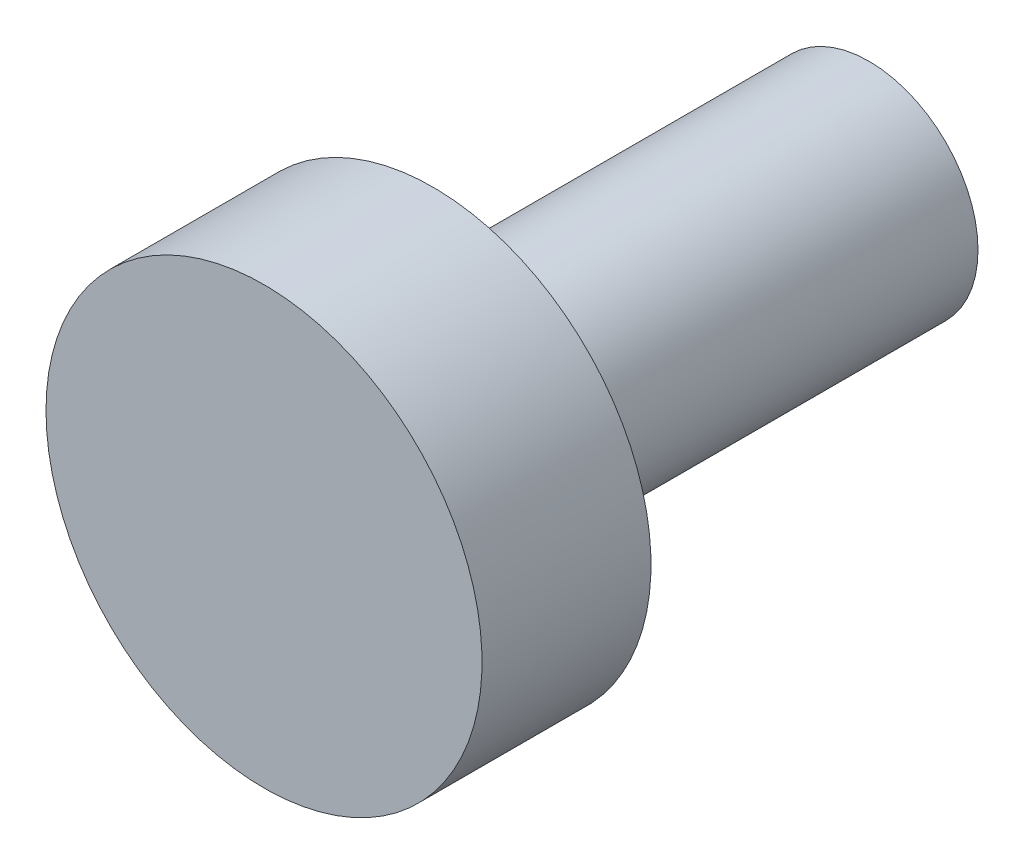
ISO-10303-21;
HEADER;
FILE_DESCRIPTION(('STEP AP214'),'2;1');
FILE_NAME('part.step','',(''),(''),'','','');
FILE_SCHEMA(('AUTOMOTIVE_DESIGN { 1 0 10303 214 1 1 1 1 }'));
ENDSEC;
DATA;
#1=APPLICATION_CONTEXT('core data for automotive mechanical design processes');
#2=APPLICATION_PROTOCOL_DEFINITION('international standard','automotive_design',2000,#1);
#3=PRODUCT_CONTEXT('',#1,'mechanical');
#4=PRODUCT('Part','Part','',(#3));
#5=PRODUCT_RELATED_PRODUCT_CATEGORY('part','',(#4));
#6=PRODUCT_DEFINITION_FORMATION('','',#4);
#7=PRODUCT_DEFINITION_CONTEXT('part definition',#1,'design');
#8=PRODUCT_DEFINITION('design','',#6,#7);
#9=PRODUCT_DEFINITION_SHAPE('','',#8);
#10=(LENGTH_UNIT() NAMED_UNIT(*) SI_UNIT(.MILLI.,.METRE.));
#11=(NAMED_UNIT(*) PLANE_ANGLE_UNIT() SI_UNIT($,.RADIAN.));
#12=(NAMED_UNIT(*) SI_UNIT($,.STERADIAN.) SOLID_ANGLE_UNIT());
#13=UNCERTAINTY_MEASURE_WITH_UNIT(LENGTH_MEASURE(1.E-05),#10,'distance_accuracy_value','');
#14=(GEOMETRIC_REPRESENTATION_CONTEXT(3) GLOBAL_UNCERTAINTY_ASSIGNED_CONTEXT((#13)) GLOBAL_UNIT_ASSIGNED_CONTEXT((#10,
#11,#12)) REPRESENTATION_CONTEXT('',''));
#15=CARTESIAN_POINT('',(0.,0.,0.));
#16=DIRECTION('',(0.,0.,1.));
#17=DIRECTION('',(1.,0.,0.));
#18=AXIS2_PLACEMENT_3D('',#15,#16,#17);
#19=CARTESIAN_POINT('',(0.,0.,3.1));
#20=DIRECTION('',(0.,0.,-1.));
#21=DIRECTION('',(-1.,0.,0.));
#22=AXIS2_PLACEMENT_3D('',#19,#20,#21);
#23=CYLINDRICAL_SURFACE('',#22,4.);
#24=CARTESIAN_POINT('',(0.,0.,3.1));
#25=DIRECTION('',(0.,0.,1.));
#26=DIRECTION('',(1.,0.,0.));
#27=AXIS2_PLACEMENT_3D('',#24,#25,#26);
#28=CIRCLE('',#27,4.);
#29=CARTESIAN_POINT('',(-4.,0.,3.1));
#30=VERTEX_POINT('',#29);
#31=EDGE_CURVE('E37',#30,#30,#28,.T.);
#32=CARTESIAN_POINT('',(0.,0.,0.));
#33=DIRECTION('',(0.,0.,1.));
#34=DIRECTION('',(1.,0.,0.));
#35=AXIS2_PLACEMENT_3D('',#32,#33,#34);
#36=CIRCLE('',#35,4.);
#37=CARTESIAN_POINT('',(-4.,0.,0.));
#38=VERTEX_POINT('',#37);
#39=EDGE_CURVE('E33',#38,#38,#36,.T.);
#40=CARTESIAN_POINT('',(-4.,0.,3.1));
#41=CARTESIAN_POINT('',(-4.,0.,3.06770833333333));
#42=CARTESIAN_POINT('',(-4.,0.,3.03541666666667));
#43=CARTESIAN_POINT('',(-4.,0.,2.97083333333333));
#44=CARTESIAN_POINT('',(-4.,0.,2.93854166666667));
#45=CARTESIAN_POINT('',(-4.,0.,2.87395833333333));
#46=CARTESIAN_POINT('',(-4.,0.,2.84166666666667));
#47=CARTESIAN_POINT('',(-4.,0.,2.77708333333333));
#48=CARTESIAN_POINT('',(-4.,0.,2.74479166666667));
#49=CARTESIAN_POINT('',(-4.,0.,2.68020833333333));
#50=CARTESIAN_POINT('',(-4.,0.,2.64791666666667));
#51=CARTESIAN_POINT('',(-4.,0.,2.58333333333333));
#52=CARTESIAN_POINT('',(-4.,0.,2.55104166666667));
#53=CARTESIAN_POINT('',(-4.,0.,2.48645833333333));
#54=CARTESIAN_POINT('',(-4.,0.,2.45416666666667));
#55=CARTESIAN_POINT('',(-4.,0.,2.38958333333333));
#56=CARTESIAN_POINT('',(-4.,0.,2.35729166666667));
#57=CARTESIAN_POINT('',(-4.,0.,2.29270833333333));
#58=CARTESIAN_POINT('',(-4.,0.,2.26041666666667));
#59=CARTESIAN_POINT('',(-4.,0.,2.19583333333333));
#60=CARTESIAN_POINT('',(-4.,0.,2.16354166666667));
#61=CARTESIAN_POINT('',(-4.,0.,2.09895833333333));
#62=CARTESIAN_POINT('',(-4.,0.,2.06666666666667));
#63=CARTESIAN_POINT('',(-4.,0.,2.00208333333333));
#64=CARTESIAN_POINT('',(-4.,0.,1.96979166666667));
#65=CARTESIAN_POINT('',(-4.,0.,1.90520833333333));
#66=CARTESIAN_POINT('',(-4.,0.,1.87291666666667));
#67=CARTESIAN_POINT('',(-4.,0.,1.80833333333333));
#68=CARTESIAN_POINT('',(-4.,0.,1.77604166666667));
#69=CARTESIAN_POINT('',(-4.,0.,1.71145833333333));
#70=CARTESIAN_POINT('',(-4.,0.,1.67916666666667));
#71=CARTESIAN_POINT('',(-4.,0.,1.61458333333333));
#72=CARTESIAN_POINT('',(-4.,0.,1.58229166666667));
#73=CARTESIAN_POINT('',(-4.,0.,1.51770833333333));
#74=CARTESIAN_POINT('',(-4.,0.,1.48541666666667));
#75=CARTESIAN_POINT('',(-4.,0.,1.42083333333333));
#76=CARTESIAN_POINT('',(-4.,0.,1.38854166666667));
#77=CARTESIAN_POINT('',(-4.,0.,1.32395833333333));
#78=CARTESIAN_POINT('',(-4.,0.,1.29166666666667));
#79=CARTESIAN_POINT('',(-4.,0.,1.22708333333333));
#80=CARTESIAN_POINT('',(-4.,0.,1.19479166666667));
#81=CARTESIAN_POINT('',(-4.,0.,1.13020833333333));
#82=CARTESIAN_POINT('',(-4.,0.,1.09791666666667));
#83=CARTESIAN_POINT('',(-4.,0.,1.03333333333333));
#84=CARTESIAN_POINT('',(-4.,0.,1.00104166666667));
#85=CARTESIAN_POINT('',(-4.,0.,0.936458333333333));
#86=CARTESIAN_POINT('',(-4.,0.,0.904166666666667));
#87=CARTESIAN_POINT('',(-4.,0.,0.839583333333333));
#88=CARTESIAN_POINT('',(-4.,0.,0.807291666666667));
#89=CARTESIAN_POINT('',(-4.,0.,0.742708333333333));
#90=CARTESIAN_POINT('',(-4.,0.,0.710416666666667));
#91=CARTESIAN_POINT('',(-4.,0.,0.645833333333333));
#92=CARTESIAN_POINT('',(-4.,0.,0.613541666666667));
#93=CARTESIAN_POINT('',(-4.,0.,0.548958333333333));
#94=CARTESIAN_POINT('',(-4.,0.,0.516666666666667));
#95=CARTESIAN_POINT('',(-4.,0.,0.452083333333333));
#96=CARTESIAN_POINT('',(-4.,0.,0.419791666666667));
#97=CARTESIAN_POINT('',(-4.,0.,0.355208333333333));
#98=CARTESIAN_POINT('',(-4.,0.,0.322916666666667));
#99=CARTESIAN_POINT('',(-4.,0.,0.258333333333333));
#100=CARTESIAN_POINT('',(-4.,0.,0.226041666666667));
#101=CARTESIAN_POINT('',(-4.,0.,0.161458333333333));
#102=CARTESIAN_POINT('',(-4.,0.,0.129166666666667));
#103=CARTESIAN_POINT('',(-4.,0.,0.0645833333333335));
#104=CARTESIAN_POINT('',(-4.,0.,0.0322916666666667));
#105=CARTESIAN_POINT('',(-4.,0.,0.));
#106=B_SPLINE_CURVE_WITH_KNOTS('',3,(#40,#41,#42,#43,#44,#45,#46,#47,#48,#49,#50,#51,#52,#53,
#54,#55,#56,#57,#58,#59,#60,#61,#62,#63,#64,#65,#66,#67,#68,#69,#70,#71,#72,#73,#74,#75,#76,#77,
#78,#79,#80,#81,#82,#83,#84,#85,#86,#87,#88,#89,#90,#91,#92,#93,#94,#95,#96,#97,#98,#99,#100,
#101,#102,#103,#104,#105),.UNSPECIFIED.,.F.,.F.,(4,2,2,2,2,2,2,2,2,2,2,2,2,2,2,2,2,2,2,2,2,2,2,
2,2,2,2,2,2,2,2,2,4),(0.,0.0968749999999997,0.19375,0.290625,0.3875,0.484375,0.58125,0.678125,
0.775,0.871874999999999,0.96875,1.065625,1.1625,1.259375,1.35625,1.453125,1.55,1.646875,1.74375,
1.840625,1.9375,2.034375,2.13125,2.228125,2.325,2.421875,2.51875,2.615625,2.7125,2.809375,
2.90625,3.003125,3.1),.UNSPECIFIED.);
#107=EDGE_CURVE('BSEAM30',#30,#38,#106,.T.);
#108=ORIENTED_EDGE('',*,*,#31,.F.);
#109=ORIENTED_EDGE('',*,*,#39,.T.);
#110=ORIENTED_EDGE('',*,*,#107,.T.);
#111=ORIENTED_EDGE('',*,*,#107,.F.);
#112=EDGE_LOOP('',(#108,#110,#109,#111));
#113=FACE_BOUND('',#112,.T.);
#114=ADVANCED_FACE('F30',(#113),#23,.T.);
#115=CARTESIAN_POINT('',(0.,0.,3.1));
#116=DIRECTION('',(0.,0.,1.));
#117=DIRECTION('',(1.,0.,0.));
#118=AXIS2_PLACEMENT_3D('',#115,#116,#117);
#119=PLANE('',#118);
#120=ORIENTED_EDGE('',*,*,#31,.T.);
#121=EDGE_LOOP('',(#120));
#122=FACE_BOUND('',#121,.T.);
#123=ADVANCED_FACE('F54',(#122),#119,.T.);
#124=CARTESIAN_POINT('',(0.,0.,0.));
#125=DIRECTION('',(0.,0.,1.));
#126=DIRECTION('',(1.,0.,0.));
#127=AXIS2_PLACEMENT_3D('',#124,#125,#126);
#128=PLANE('',#127);
#129=CARTESIAN_POINT('',(0.,0.,0.));
#130=DIRECTION('',(0.,0.,-1.));
#131=DIRECTION('',(-1.,0.,0.));
#132=AXIS2_PLACEMENT_3D('',#129,#130,#131);
#133=CIRCLE('',#132,2.);
#134=CARTESIAN_POINT('',(-2.,0.,0.));
#135=VERTEX_POINT('',#134);
#136=EDGE_CURVE('E10',#135,#135,#133,.T.);
#137=ORIENTED_EDGE('',*,*,#136,.F.);
#138=EDGE_LOOP('',(#137));
#139=FACE_BOUND('',#138,.T.);
#140=ORIENTED_EDGE('',*,*,#39,.F.);
#141=EDGE_LOOP('',(#140));
#142=FACE_BOUND('',#141,.T.);
#143=ADVANCED_FACE('F51',(#139,#142),#128,.F.);
#144=CARTESIAN_POINT('',(0.,0.,-8.));
#145=DIRECTION('',(0.,0.,1.));
#146=DIRECTION('',(1.,0.,0.));
#147=AXIS2_PLACEMENT_3D('',#144,#145,#146);
#148=CYLINDRICAL_SURFACE('',#147,2.);
#149=CARTESIAN_POINT('',(0.,0.,-8.));
#150=DIRECTION('',(0.,0.,-1.));
#151=DIRECTION('',(-1.,0.,0.));
#152=AXIS2_PLACEMENT_3D('',#149,#150,#151);
#153=CIRCLE('',#152,2.);
#154=CARTESIAN_POINT('',(-2.,0.,-8.));
#155=VERTEX_POINT('',#154);
#156=EDGE_CURVE('E43',#155,#155,#153,.T.);
#157=ORIENTED_EDGE('',*,*,#156,.F.);
#158=EDGE_LOOP('',(#157));
#159=FACE_BOUND('',#158,.T.);
#160=ORIENTED_EDGE('',*,*,#136,.T.);
#161=EDGE_LOOP('',(#160));
#162=FACE_BOUND('',#161,.T.);
#163=ADVANCED_FACE('F53',(#159,#162),#148,.T.);
#164=CARTESIAN_POINT('',(0.,0.,-8.));
#165=DIRECTION('',(0.,0.,-1.));
#166=DIRECTION('',(-1.,0.,0.));
#167=AXIS2_PLACEMENT_3D('',#164,#165,#166);
#168=PLANE('',#167);
#169=ORIENTED_EDGE('',*,*,#156,.T.);
#170=EDGE_LOOP('',(#169));
#171=FACE_BOUND('',#170,.T.);
#172=ADVANCED_FACE('F60',(#171),#168,.T.);
#173=CLOSED_SHELL('',(#114,#123,#143,#163,#172));
#174=MANIFOLD_SOLID_BREP('B2',#173);
#175=ADVANCED_BREP_SHAPE_REPRESENTATION('',(#18,#174),#14);
#176=SHAPE_DEFINITION_REPRESENTATION(#9,#175);
ENDSEC;
END-ISO-10303-21;
